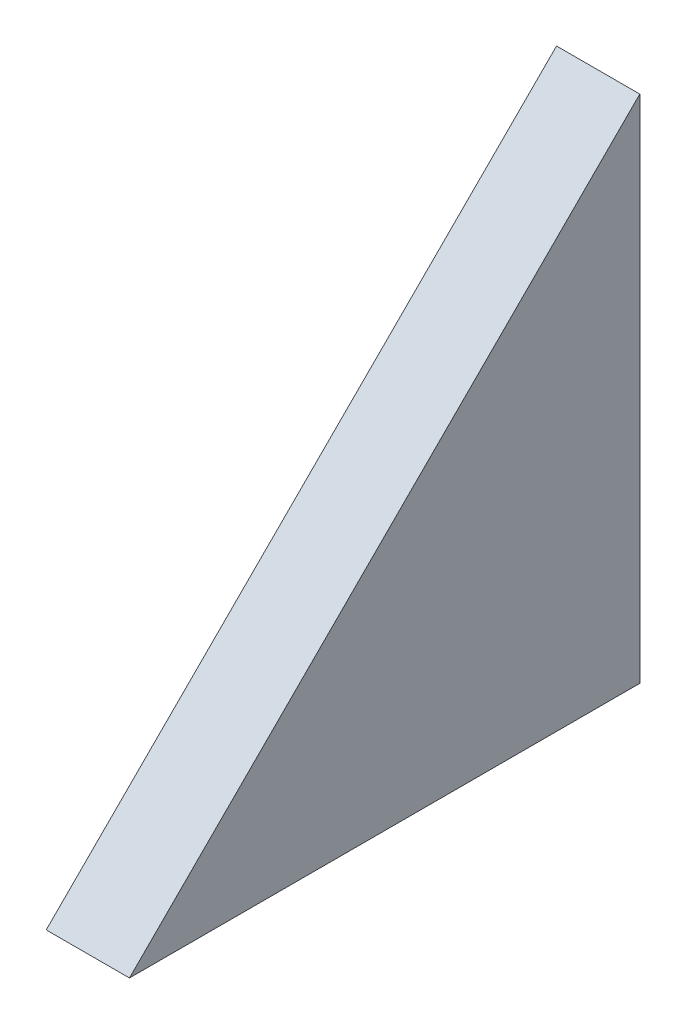
ISO-10303-21;
HEADER;
FILE_DESCRIPTION(('STEP AP214'),'2;1');
FILE_NAME('part.step','',(''),(''),'','','');
FILE_SCHEMA(('AUTOMOTIVE_DESIGN { 1 0 10303 214 1 1 1 1 }'));
ENDSEC;
DATA;
#1=APPLICATION_CONTEXT('core data for automotive mechanical design processes');
#2=APPLICATION_PROTOCOL_DEFINITION('international standard','automotive_design',2000,#1);
#3=PRODUCT_CONTEXT('',#1,'mechanical');
#4=PRODUCT('Part','Part','',(#3));
#5=PRODUCT_RELATED_PRODUCT_CATEGORY('part','',(#4));
#6=PRODUCT_DEFINITION_FORMATION('','',#4);
#7=PRODUCT_DEFINITION_CONTEXT('part definition',#1,'design');
#8=PRODUCT_DEFINITION('design','',#6,#7);
#9=PRODUCT_DEFINITION_SHAPE('','',#8);
#10=(LENGTH_UNIT() NAMED_UNIT(*) SI_UNIT(.MILLI.,.METRE.));
#11=(NAMED_UNIT(*) PLANE_ANGLE_UNIT() SI_UNIT($,.RADIAN.));
#12=(NAMED_UNIT(*) SI_UNIT($,.STERADIAN.) SOLID_ANGLE_UNIT());
#13=UNCERTAINTY_MEASURE_WITH_UNIT(LENGTH_MEASURE(1.E-05),#10,'distance_accuracy_value','');
#14=(GEOMETRIC_REPRESENTATION_CONTEXT(3) GLOBAL_UNCERTAINTY_ASSIGNED_CONTEXT((#13)) GLOBAL_UNIT_ASSIGNED_CONTEXT((#10,
#11,#12)) REPRESENTATION_CONTEXT('',''));
#15=CARTESIAN_POINT('',(0.,0.,0.));
#16=DIRECTION('',(0.,0.,1.));
#17=DIRECTION('',(1.,0.,0.));
#18=AXIS2_PLACEMENT_3D('',#15,#16,#17);
#19=CARTESIAN_POINT('',(19.05,96.9547156420333,39.5227511197092));
#20=DIRECTION('',(0.,-0.707106781186551,-0.707106781186544));
#21=DIRECTION('',(0.,0.707106781186544,-0.707106781186551));
#22=AXIS2_PLACEMENT_3D('',#19,#20,#21);
#23=PLANE('',#22);
#24=DIRECTION('',(0.,-0.707106781186544,0.707106781186551));
#25=VECTOR('',#24,1.);
#26=CARTESIAN_POINT('',(0.,96.9547156420333,39.5227511197092));
#27=LINE('',#26,#25);
#28=CARTESIAN_POINT('',(0.,96.9547156420333,39.5227511197092));
#29=VERTEX_POINT('',#28);
#30=CARTESIAN_POINT('',(0.,-19.7886139318651,156.266080693609));
#31=VERTEX_POINT('',#30);
#32=EDGE_CURVE('E80',#29,#31,#27,.T.);
#33=ORIENTED_EDGE('',*,*,#32,.T.);
#34=DIRECTION('',(-1.,0.,0.));
#35=VECTOR('',#34,1.);
#36=CARTESIAN_POINT('',(19.05,-19.7886139318651,156.266080693609));
#37=LINE('',#36,#35);
#38=CARTESIAN_POINT('',(19.05,-19.7886139318651,156.266080693609));
#39=VERTEX_POINT('',#38);
#40=EDGE_CURVE('E11',#39,#31,#37,.T.);
#41=ORIENTED_EDGE('',*,*,#40,.F.);
#42=DIRECTION('',(0.,-0.707106781186544,0.707106781186551));
#43=VECTOR('',#42,1.);
#44=CARTESIAN_POINT('',(19.05,96.9547156420333,39.5227511197092));
#45=LINE('',#44,#43);
#46=CARTESIAN_POINT('',(19.05,96.9547156420333,39.5227511197092));
#47=VERTEX_POINT('',#46);
#48=EDGE_CURVE('E75',#47,#39,#45,.T.);
#49=ORIENTED_EDGE('',*,*,#48,.F.);
#50=DIRECTION('',(-1.,0.,0.));
#51=VECTOR('',#50,1.);
#52=CARTESIAN_POINT('',(19.05,96.9547156420333,39.5227511197092));
#53=LINE('',#52,#51);
#54=EDGE_CURVE('E50',#47,#29,#53,.T.);
#55=ORIENTED_EDGE('',*,*,#54,.T.);
#56=EDGE_LOOP('',(#33,#41,#49,#55));
#57=FACE_BOUND('',#56,.T.);
#58=ADVANCED_FACE('F34',(#57),#23,.F.);
#59=CARTESIAN_POINT('',(19.05,-19.7886139318651,156.266080693609));
#60=DIRECTION('',(0.,1.,0.));
#61=DIRECTION('',(0.,0.,1.));
#62=AXIS2_PLACEMENT_3D('',#59,#60,#61);
#63=PLANE('',#62);
#64=DIRECTION('',(0.,0.,-1.));
#65=VECTOR('',#64,1.);
#66=CARTESIAN_POINT('',(0.,-19.7886139318651,156.266080693609));
#67=LINE('',#66,#65);
#68=CARTESIAN_POINT('',(0.,-19.788613931865,39.5227511197092));
#69=VERTEX_POINT('',#68);
#70=EDGE_CURVE('E83',#31,#69,#67,.T.);
#71=ORIENTED_EDGE('',*,*,#70,.T.);
#72=DIRECTION('',(-1.,0.,0.));
#73=VECTOR('',#72,1.);
#74=CARTESIAN_POINT('',(19.05,-19.788613931865,39.5227511197092));
#75=LINE('',#74,#73);
#76=CARTESIAN_POINT('',(19.05,-19.788613931865,39.5227511197092));
#77=VERTEX_POINT('',#76);
#78=EDGE_CURVE('E42',#77,#69,#75,.T.);
#79=ORIENTED_EDGE('',*,*,#78,.F.);
#80=DIRECTION('',(0.,0.,-1.));
#81=VECTOR('',#80,1.);
#82=CARTESIAN_POINT('',(19.05,-19.7886139318651,156.266080693609));
#83=LINE('',#82,#81);
#84=EDGE_CURVE('E68',#39,#77,#83,.T.);
#85=ORIENTED_EDGE('',*,*,#84,.F.);
#86=ORIENTED_EDGE('',*,*,#40,.T.);
#87=EDGE_LOOP('',(#71,#79,#85,#86));
#88=FACE_BOUND('',#87,.T.);
#89=ADVANCED_FACE('F70',(#88),#63,.F.);
#90=CARTESIAN_POINT('',(19.05,96.9547156420333,39.5227511197092));
#91=DIRECTION('',(0.,0.,-1.));
#92=DIRECTION('',(0.,1.,0.));
#93=AXIS2_PLACEMENT_3D('',#90,#91,#92);
#94=PLANE('',#93);
#95=DIRECTION('',(0.,-1.,0.));
#96=VECTOR('',#95,1.);
#97=CARTESIAN_POINT('',(0.,96.9547156420333,39.5227511197092));
#98=LINE('',#97,#96);
#99=EDGE_CURVE('E78',#29,#69,#98,.T.);
#100=ORIENTED_EDGE('',*,*,#99,.F.);
#101=ORIENTED_EDGE('',*,*,#54,.F.);
#102=DIRECTION('',(0.,-1.,0.));
#103=VECTOR('',#102,1.);
#104=CARTESIAN_POINT('',(19.05,96.9547156420333,39.5227511197092));
#105=LINE('',#104,#103);
#106=EDGE_CURVE('E74',#47,#77,#105,.T.);
#107=ORIENTED_EDGE('',*,*,#106,.T.);
#108=ORIENTED_EDGE('',*,*,#78,.T.);
#109=EDGE_LOOP('',(#100,#101,#107,#108));
#110=FACE_BOUND('',#109,.T.);
#111=ADVANCED_FACE('F89',(#110),#94,.T.);
#112=CARTESIAN_POINT('',(19.05,0.,0.));
#113=DIRECTION('',(1.,0.,0.));
#114=DIRECTION('',(0.,0.,-1.));
#115=AXIS2_PLACEMENT_3D('',#112,#113,#114);
#116=PLANE('',#115);
#117=ORIENTED_EDGE('',*,*,#48,.T.);
#118=ORIENTED_EDGE('',*,*,#84,.T.);
#119=ORIENTED_EDGE('',*,*,#106,.F.);
#120=EDGE_LOOP('',(#117,#118,#119));
#121=FACE_BOUND('',#120,.T.);
#122=ADVANCED_FACE('F77',(#121),#116,.T.);
#123=CARTESIAN_POINT('',(0.,0.,0.));
#124=DIRECTION('',(1.,0.,0.));
#125=DIRECTION('',(0.,0.,-1.));
#126=AXIS2_PLACEMENT_3D('',#123,#124,#125);
#127=PLANE('',#126);
#128=ORIENTED_EDGE('',*,*,#32,.F.);
#129=ORIENTED_EDGE('',*,*,#99,.T.);
#130=ORIENTED_EDGE('',*,*,#70,.F.);
#131=EDGE_LOOP('',(#128,#129,#130));
#132=FACE_BOUND('',#131,.T.);
#133=ADVANCED_FACE('F96',(#132),#127,.F.);
#134=CLOSED_SHELL('',(#58,#89,#111,#122,#133));
#135=MANIFOLD_SOLID_BREP('B2',#134);
#136=ADVANCED_BREP_SHAPE_REPRESENTATION('',(#18,#135),#14);
#137=SHAPE_DEFINITION_REPRESENTATION(#9,#136);
ENDSEC;
END-ISO-10303-21;
